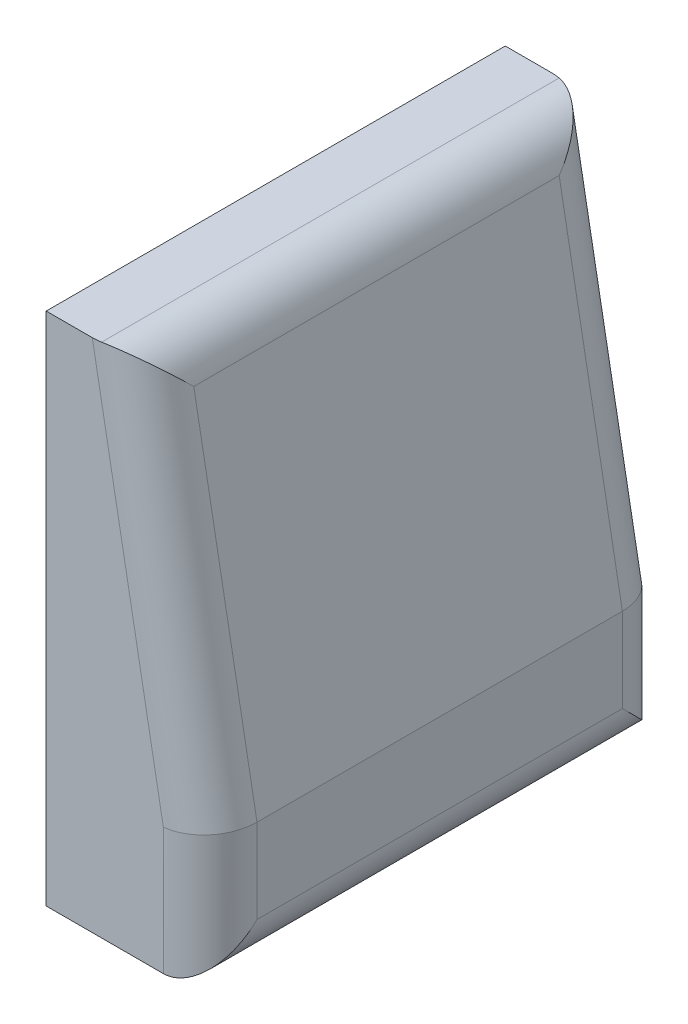
ISO-10303-21;
HEADER;
FILE_DESCRIPTION(('STEP AP214'),'2;1');
FILE_NAME('part.step','',(''),(''),'','','');
FILE_SCHEMA(('AUTOMOTIVE_DESIGN { 1 0 10303 214 1 1 1 1 }'));
ENDSEC;
DATA;
#1=APPLICATION_CONTEXT('core data for automotive mechanical design processes');
#2=APPLICATION_PROTOCOL_DEFINITION('international standard','automotive_design',2000,#1);
#3=PRODUCT_CONTEXT('',#1,'mechanical');
#4=PRODUCT('Part','Part','',(#3));
#5=PRODUCT_RELATED_PRODUCT_CATEGORY('part','',(#4));
#6=PRODUCT_DEFINITION_FORMATION('','',#4);
#7=PRODUCT_DEFINITION_CONTEXT('part definition',#1,'design');
#8=PRODUCT_DEFINITION('design','',#6,#7);
#9=PRODUCT_DEFINITION_SHAPE('','',#8);
#10=(LENGTH_UNIT() NAMED_UNIT(*) SI_UNIT(.MILLI.,.METRE.));
#11=(NAMED_UNIT(*) PLANE_ANGLE_UNIT() SI_UNIT($,.RADIAN.));
#12=(NAMED_UNIT(*) SI_UNIT($,.STERADIAN.) SOLID_ANGLE_UNIT());
#13=UNCERTAINTY_MEASURE_WITH_UNIT(LENGTH_MEASURE(1.E-05),#10,'distance_accuracy_value','');
#14=(GEOMETRIC_REPRESENTATION_CONTEXT(3) GLOBAL_UNCERTAINTY_ASSIGNED_CONTEXT((#13)) GLOBAL_UNIT_ASSIGNED_CONTEXT((#10,
#11,#12)) REPRESENTATION_CONTEXT('',''));
#15=CARTESIAN_POINT('',(0.,0.,0.));
#16=DIRECTION('',(0.,0.,1.));
#17=DIRECTION('',(1.,0.,0.));
#18=AXIS2_PLACEMENT_3D('',#15,#16,#17);
#19=CARTESIAN_POINT('',(200.,550.,490.));
#20=DIRECTION('',(0.,-1.,0.));
#21=DIRECTION('',(0.,0.,-1.));
#22=AXIS2_PLACEMENT_3D('',#19,#20,#21);
#23=PLANE('',#22);
#24=DIRECTION('',(0.,0.,-1.));
#25=VECTOR('',#24,1.);
#26=CARTESIAN_POINT('',(116.633338798208,550.,490.));
#27=LINE('',#26,#25);
#28=CARTESIAN_POINT('',(116.633338798208,550.,488.367740670723));
#29=VERTEX_POINT('',#28);
#30=CARTESIAN_POINT('',(116.633338798208,550.,-488.367740670723));
#31=VERTEX_POINT('',#30);
#32=EDGE_CURVE('E49',#29,#31,#27,.T.);
#33=ORIENTED_EDGE('',*,*,#32,.T.);
#34=CARTESIAN_POINT('',(98.3406558713785,550.,-390.));
#35=DIRECTION('',(0.,-1.,0.));
#36=DIRECTION('',(-1.,0.,0.));
#37=AXIS2_PLACEMENT_3D('',#34,#35,#36);
#38=ELLIPSE('',#37,101.659344128622,100.);
#39=CARTESIAN_POINT('',(98.3406558713786,550.,-490.));
#40=VERTEX_POINT('',#39);
#41=EDGE_CURVE('E11',#31,#40,#38,.F.);
#42=ORIENTED_EDGE('',*,*,#41,.T.);
#43=DIRECTION('',(-1.,0.,0.));
#44=VECTOR('',#43,1.);
#45=CARTESIAN_POINT('',(200.,550.,-490.));
#46=LINE('',#45,#44);
#47=CARTESIAN_POINT('',(1.38210138760916E-13,550.,-490.));
#48=VERTEX_POINT('',#47);
#49=EDGE_CURVE('E122',#40,#48,#46,.T.);
#50=ORIENTED_EDGE('',*,*,#49,.T.);
#51=DIRECTION('',(0.,0.,-1.));
#52=VECTOR('',#51,1.);
#53=CARTESIAN_POINT('',(1.38210138760916E-13,550.,490.));
#54=LINE('',#53,#52);
#55=CARTESIAN_POINT('',(1.38210138760916E-13,550.,490.));
#56=VERTEX_POINT('',#55);
#57=EDGE_CURVE('E115',#56,#48,#54,.T.);
#58=ORIENTED_EDGE('',*,*,#57,.F.);
#59=DIRECTION('',(-1.,0.,0.));
#60=VECTOR('',#59,1.);
#61=CARTESIAN_POINT('',(200.,550.,490.));
#62=LINE('',#61,#60);
#63=CARTESIAN_POINT('',(98.3406558713785,550.,490.));
#64=VERTEX_POINT('',#63);
#65=EDGE_CURVE('E101',#64,#56,#62,.T.);
#66=ORIENTED_EDGE('',*,*,#65,.F.);
#67=CARTESIAN_POINT('',(98.3406558713785,550.,390.));
#68=DIRECTION('',(0.,-1.,0.));
#69=DIRECTION('',(1.,0.,0.));
#70=AXIS2_PLACEMENT_3D('',#67,#68,#69);
#71=ELLIPSE('',#70,101.659344128622,100.);
#72=EDGE_CURVE('E42',#64,#29,#71,.F.);
#73=ORIENTED_EDGE('',*,*,#72,.T.);
#74=EDGE_LOOP('',(#33,#42,#50,#58,#66,#73));
#75=FACE_BOUND('',#74,.T.);
#76=ADVANCED_FACE('F33',(#75),#23,.F.);
#77=CARTESIAN_POINT('',(1.38210138760916E-13,550.,490.));
#78=DIRECTION('',(1.,0.,0.));
#79=DIRECTION('',(0.,0.,-1.));
#80=AXIS2_PLACEMENT_3D('',#77,#78,#79);
#81=PLANE('',#80);
#82=DIRECTION('',(0.,-1.,0.));
#83=VECTOR('',#82,1.);
#84=CARTESIAN_POINT('',(1.38210138760916E-13,550.,-490.));
#85=LINE('',#84,#83);
#86=CARTESIAN_POINT('',(1.38210138760916E-13,-550.,-490.));
#87=VERTEX_POINT('',#86);
#88=EDGE_CURVE('E172',#48,#87,#85,.T.);
#89=ORIENTED_EDGE('',*,*,#88,.T.);
#90=DIRECTION('',(0.,0.,-1.));
#91=VECTOR('',#90,1.);
#92=CARTESIAN_POINT('',(1.38210138760916E-13,-550.,490.));
#93=LINE('',#92,#91);
#94=CARTESIAN_POINT('',(1.38210138760916E-13,-550.,490.));
#95=VERTEX_POINT('',#94);
#96=EDGE_CURVE('E117',#95,#87,#93,.T.);
#97=ORIENTED_EDGE('',*,*,#96,.F.);
#98=DIRECTION('',(0.,-1.,0.));
#99=VECTOR('',#98,1.);
#100=CARTESIAN_POINT('',(1.38210138760916E-13,550.,490.));
#101=LINE('',#100,#99);
#102=EDGE_CURVE('E105',#56,#95,#101,.T.);
#103=ORIENTED_EDGE('',*,*,#102,.F.);
#104=ORIENTED_EDGE('',*,*,#57,.T.);
#105=EDGE_LOOP('',(#89,#97,#103,#104));
#106=FACE_BOUND('',#105,.T.);
#107=ADVANCED_FACE('F114',(#106),#81,.F.);
#108=CARTESIAN_POINT('',(1.38210138760916E-13,-550.,490.));
#109=DIRECTION('',(0.,1.,0.));
#110=DIRECTION('',(-1.,0.,0.));
#111=AXIS2_PLACEMENT_3D('',#108,#109,#110);
#112=PLANE('',#111);
#113=DIRECTION('',(1.,0.,0.));
#114=VECTOR('',#113,1.);
#115=CARTESIAN_POINT('',(1.38210138760916E-13,-550.,-490.));
#116=LINE('',#115,#114);
#117=CARTESIAN_POINT('',(250.,-550.,-490.));
#118=VERTEX_POINT('',#117);
#119=EDGE_CURVE('E110',#87,#118,#116,.T.);
#120=ORIENTED_EDGE('',*,*,#119,.T.);
#121=DIRECTION('',(0.,0.,-1.));
#122=VECTOR('',#121,1.);
#123=CARTESIAN_POINT('',(250.,-550.,490.));
#124=LINE('',#123,#122);
#125=CARTESIAN_POINT('',(250.,-550.,490.));
#126=VERTEX_POINT('',#125);
#127=EDGE_CURVE('E136',#118,#126,#124,.F.);
#128=ORIENTED_EDGE('',*,*,#127,.T.);
#129=DIRECTION('',(1.,0.,0.));
#130=VECTOR('',#129,1.);
#131=CARTESIAN_POINT('',(1.38210138760916E-13,-550.,490.));
#132=LINE('',#131,#130);
#133=EDGE_CURVE('E119',#95,#126,#132,.T.);
#134=ORIENTED_EDGE('',*,*,#133,.F.);
#135=ORIENTED_EDGE('',*,*,#96,.T.);
#136=EDGE_LOOP('',(#120,#128,#134,#135));
#137=FACE_BOUND('',#136,.T.);
#138=ADVANCED_FACE('F183',(#137),#112,.F.);
#139=CARTESIAN_POINT('',(350.,-550.,490.));
#140=DIRECTION('',(-1.,0.,0.));
#141=DIRECTION('',(0.,0.,1.));
#142=AXIS2_PLACEMENT_3D('',#139,#140,#141);
#143=PLANE('',#142);
#144=DIRECTION('',(0.,0.,-1.));
#145=VECTOR('',#144,1.);
#146=CARTESIAN_POINT('',(350.,-270.,490.));
#147=LINE('',#146,#145);
#148=CARTESIAN_POINT('',(350.,-270.,390.));
#149=VERTEX_POINT('',#148);
#150=CARTESIAN_POINT('',(350.,-270.,-390.));
#151=VERTEX_POINT('',#150);
#152=EDGE_CURVE('E128',#149,#151,#147,.T.);
#153=ORIENTED_EDGE('',*,*,#152,.F.);
#154=DIRECTION('',(0.,1.,0.));
#155=VECTOR('',#154,1.);
#156=CARTESIAN_POINT('',(350.,-550.,390.));
#157=LINE('',#156,#155);
#158=CARTESIAN_POINT('',(350.,-450.,390.));
#159=VERTEX_POINT('',#158);
#160=EDGE_CURVE('E134',#149,#159,#157,.F.);
#161=ORIENTED_EDGE('',*,*,#160,.T.);
#162=DIRECTION('',(0.,0.,-1.));
#163=VECTOR('',#162,1.);
#164=CARTESIAN_POINT('',(350.,-450.,490.));
#165=LINE('',#164,#163);
#166=CARTESIAN_POINT('',(350.,-450.,-390.));
#167=VERTEX_POINT('',#166);
#168=EDGE_CURVE('E126',#159,#167,#165,.T.);
#169=ORIENTED_EDGE('',*,*,#168,.T.);
#170=DIRECTION('',(0.,1.,0.));
#171=VECTOR('',#170,1.);
#172=CARTESIAN_POINT('',(350.,-550.,-390.));
#173=LINE('',#172,#171);
#174=EDGE_CURVE('E124',#167,#151,#173,.T.);
#175=ORIENTED_EDGE('',*,*,#174,.T.);
#176=EDGE_LOOP('',(#153,#161,#169,#175));
#177=FACE_BOUND('',#176,.T.);
#178=ADVANCED_FACE('F197',(#177),#143,.F.);
#179=CARTESIAN_POINT('',(350.,-270.,490.));
#180=DIRECTION('',(-0.983677406707227,-0.17994098903181,0.));
#181=DIRECTION('',(0.17994098903181,-0.983677406707227,0.));
#182=AXIS2_PLACEMENT_3D('',#179,#180,#181);
#183=PLANE('',#182);
#184=ORIENTED_EDGE('',*,*,#152,.T.);
#185=DIRECTION('',(-0.17994098903181,0.983677406707227,0.));
#186=VECTOR('',#185,1.);
#187=CARTESIAN_POINT('',(350.,-270.,-390.));
#188=LINE('',#187,#186);
#189=CARTESIAN_POINT('',(215.00107946893,467.994098903181,-390.));
#190=VERTEX_POINT('',#189);
#191=EDGE_CURVE('E150',#151,#190,#188,.T.);
#192=ORIENTED_EDGE('',*,*,#191,.T.);
#193=DIRECTION('',(0.,0.,-1.));
#194=VECTOR('',#193,1.);
#195=CARTESIAN_POINT('',(215.00107946893,467.994098903181,490.));
#196=LINE('',#195,#194);
#197=CARTESIAN_POINT('',(215.00107946893,467.994098903181,390.));
#198=VERTEX_POINT('',#197);
#199=EDGE_CURVE('E146',#190,#198,#196,.F.);
#200=ORIENTED_EDGE('',*,*,#199,.T.);
#201=DIRECTION('',(-0.17994098903181,0.983677406707227,0.));
#202=VECTOR('',#201,1.);
#203=CARTESIAN_POINT('',(350.,-270.,390.));
#204=LINE('',#203,#202);
#205=EDGE_CURVE('E148',#198,#149,#204,.F.);
#206=ORIENTED_EDGE('',*,*,#205,.T.);
#207=EDGE_LOOP('',(#184,#192,#200,#206));
#208=FACE_BOUND('',#207,.T.);
#209=ADVANCED_FACE('F203',(#208),#183,.F.);
#210=CARTESIAN_POINT('',(0.,0.,490.));
#211=DIRECTION('',(0.,0.,1.));
#212=DIRECTION('',(1.,0.,0.));
#213=AXIS2_PLACEMENT_3D('',#210,#211,#212);
#214=PLANE('',#213);
#215=ORIENTED_EDGE('',*,*,#133,.T.);
#216=DIRECTION('',(0.,1.,0.));
#217=VECTOR('',#216,1.);
#218=CARTESIAN_POINT('',(250.,-270.,490.));
#219=LINE('',#218,#217);
#220=CARTESIAN_POINT('',(250.,-279.071081236465,490.));
#221=VERTEX_POINT('',#220);
#222=EDGE_CURVE('E140',#126,#221,#219,.T.);
#223=ORIENTED_EDGE('',*,*,#222,.T.);
#224=DIRECTION('',(-0.17994098903181,0.983677406707227,0.));
#225=VECTOR('',#224,1.);
#226=CARTESIAN_POINT('',(101.632259329277,532.005901096819,490.));
#227=LINE('',#226,#225);
#228=EDGE_CURVE('E108',#221,#64,#227,.T.);
#229=ORIENTED_EDGE('',*,*,#228,.T.);
#230=ORIENTED_EDGE('',*,*,#65,.T.);
#231=ORIENTED_EDGE('',*,*,#102,.T.);
#232=EDGE_LOOP('',(#215,#223,#229,#230,#231));
#233=FACE_BOUND('',#232,.T.);
#234=ADVANCED_FACE('F104',(#233),#214,.T.);
#235=CARTESIAN_POINT('',(0.,0.,-490.));
#236=DIRECTION('',(0.,0.,1.));
#237=DIRECTION('',(1.,0.,0.));
#238=AXIS2_PLACEMENT_3D('',#235,#236,#237);
#239=PLANE('',#238);
#240=DIRECTION('',(-0.17994098903181,0.983677406707227,0.));
#241=VECTOR('',#240,1.);
#242=CARTESIAN_POINT('',(192.508644420657,35.2149959306081,-490.));
#243=LINE('',#242,#241);
#244=CARTESIAN_POINT('',(250.,-279.071081236465,-490.));
#245=VERTEX_POINT('',#244);
#246=EDGE_CURVE('E142',#40,#245,#243,.F.);
#247=ORIENTED_EDGE('',*,*,#246,.T.);
#248=DIRECTION('',(0.,1.,0.));
#249=VECTOR('',#248,1.);
#250=CARTESIAN_POINT('',(250.,0.,-490.));
#251=LINE('',#250,#249);
#252=EDGE_CURVE('E144',#245,#118,#251,.F.);
#253=ORIENTED_EDGE('',*,*,#252,.T.);
#254=ORIENTED_EDGE('',*,*,#119,.F.);
#255=ORIENTED_EDGE('',*,*,#88,.F.);
#256=ORIENTED_EDGE('',*,*,#49,.F.);
#257=EDGE_LOOP('',(#247,#253,#254,#255,#256));
#258=FACE_BOUND('',#257,.T.);
#259=ADVANCED_FACE('F209',(#258),#239,.F.);
#260=CARTESIAN_POINT('',(116.633338798208,450.,490.));
#261=DIRECTION('',(0.,0.,-1.));
#262=DIRECTION('',(-1.,0.,0.));
#263=AXIS2_PLACEMENT_3D('',#260,#261,#262);
#264=CYLINDRICAL_SURFACE('',#263,100.);
#265=CARTESIAN_POINT('',(116.633338798208,450.,-390.));
#266=DIRECTION('',(0.127237493557807,-0.695564964782677,-0.707106781186547));
#267=DIRECTION('',(-0.127237493557807,0.695564964782677,-0.707106781186547));
#268=AXIS2_PLACEMENT_3D('',#265,#266,#267);
#269=ELLIPSE('',#268,141.42135623731,100.);
#270=EDGE_CURVE('E163',#31,#190,#269,.T.);
#271=ORIENTED_EDGE('',*,*,#270,.F.);
#272=ORIENTED_EDGE('',*,*,#32,.F.);
#273=CARTESIAN_POINT('',(116.633338798208,450.,390.));
#274=DIRECTION('',(-0.127237493557807,0.695564964782677,-0.707106781186547));
#275=DIRECTION('',(0.127237493557807,-0.695564964782677,-0.707106781186547));
#276=AXIS2_PLACEMENT_3D('',#273,#274,#275);
#277=ELLIPSE('',#276,141.42135623731,100.);
#278=EDGE_CURVE('E37',#198,#29,#277,.F.);
#279=ORIENTED_EDGE('',*,*,#278,.F.);
#280=ORIENTED_EDGE('',*,*,#199,.F.);
#281=EDGE_LOOP('',(#271,#272,#279,#280));
#282=FACE_BOUND('',#281,.T.);
#283=ADVANCED_FACE('F35',(#282),#264,.T.);
#284=CARTESIAN_POINT('',(192.508644420657,35.2149959306081,390.));
#285=DIRECTION('',(0.17994098903181,-0.983677406707227,0.));
#286=DIRECTION('',(0.983677406707227,0.17994098903181,0.));
#287=AXIS2_PLACEMENT_3D('',#284,#285,#286);
#288=CYLINDRICAL_SURFACE('',#287,100.);
#289=ORIENTED_EDGE('',*,*,#72,.F.);
#290=ORIENTED_EDGE('',*,*,#228,.F.);
#291=CARTESIAN_POINT('',(250.,-279.071081236465,390.));
#292=DIRECTION('',(0.0903398950983827,-0.995910991682295,0.));
#293=DIRECTION('',(0.995910991682295,0.0903398950983818,0.));
#294=AXIS2_PLACEMENT_3D('',#291,#292,#293);
#295=ELLIPSE('',#294,100.410579695561,100.);
#296=EDGE_CURVE('E161',#149,#221,#295,.T.);
#297=ORIENTED_EDGE('',*,*,#296,.F.);
#298=ORIENTED_EDGE('',*,*,#205,.F.);
#299=ORIENTED_EDGE('',*,*,#278,.T.);
#300=EDGE_LOOP('',(#289,#290,#297,#298,#299));
#301=FACE_BOUND('',#300,.T.);
#302=ADVANCED_FACE('F202',(#301),#288,.T.);
#303=CARTESIAN_POINT('',(251.632259329277,-287.994098903181,-390.));
#304=DIRECTION('',(-0.17994098903181,0.983677406707227,0.));
#305=DIRECTION('',(-0.983677406707227,-0.17994098903181,0.));
#306=AXIS2_PLACEMENT_3D('',#303,#304,#305);
#307=CYLINDRICAL_SURFACE('',#306,100.);
#308=ORIENTED_EDGE('',*,*,#270,.T.);
#309=ORIENTED_EDGE('',*,*,#191,.F.);
#310=CARTESIAN_POINT('',(250.,-279.071081236464,-390.));
#311=DIRECTION('',(-0.0903398950983827,0.995910991682295,0.));
#312=DIRECTION('',(-0.995910991682295,-0.0903398950983818,0.));
#313=AXIS2_PLACEMENT_3D('',#310,#311,#312);
#314=ELLIPSE('',#313,100.410579695561,100.);
#315=EDGE_CURVE('E158',#245,#151,#314,.F.);
#316=ORIENTED_EDGE('',*,*,#315,.F.);
#317=ORIENTED_EDGE('',*,*,#246,.F.);
#318=ORIENTED_EDGE('',*,*,#41,.F.);
#319=EDGE_LOOP('',(#308,#309,#316,#317,#318));
#320=FACE_BOUND('',#319,.T.);
#321=ADVANCED_FACE('F207',(#320),#307,.T.);
#322=CARTESIAN_POINT('',(250.,0.,390.));
#323=DIRECTION('',(0.,-1.,0.));
#324=DIRECTION('',(0.,0.,-1.));
#325=AXIS2_PLACEMENT_3D('',#322,#323,#324);
#326=CYLINDRICAL_SURFACE('',#325,100.);
#327=ORIENTED_EDGE('',*,*,#296,.T.);
#328=ORIENTED_EDGE('',*,*,#222,.F.);
#329=CARTESIAN_POINT('',(250.,-450.,390.));
#330=DIRECTION('',(0.,-0.707106781186547,-0.707106781186547));
#331=DIRECTION('',(0.,-0.707106781186547,0.707106781186547));
#332=AXIS2_PLACEMENT_3D('',#329,#330,#331);
#333=ELLIPSE('',#332,141.42135623731,100.);
#334=EDGE_CURVE('E156',#159,#126,#333,.T.);
#335=ORIENTED_EDGE('',*,*,#334,.F.);
#336=ORIENTED_EDGE('',*,*,#160,.F.);
#337=EDGE_LOOP('',(#327,#328,#335,#336));
#338=FACE_BOUND('',#337,.T.);
#339=ADVANCED_FACE('F201',(#338),#326,.T.);
#340=CARTESIAN_POINT('',(250.,-550.,-390.));
#341=DIRECTION('',(0.,1.,0.));
#342=DIRECTION('',(0.,0.,1.));
#343=AXIS2_PLACEMENT_3D('',#340,#341,#342);
#344=CYLINDRICAL_SURFACE('',#343,100.);
#345=ORIENTED_EDGE('',*,*,#315,.T.);
#346=ORIENTED_EDGE('',*,*,#174,.F.);
#347=CARTESIAN_POINT('',(250.,-450.,-390.));
#348=DIRECTION('',(0.,0.707106781186547,-0.707106781186547));
#349=DIRECTION('',(0.,0.707106781186547,0.707106781186547));
#350=AXIS2_PLACEMENT_3D('',#347,#348,#349);
#351=ELLIPSE('',#350,141.42135623731,100.);
#352=EDGE_CURVE('E154',#118,#167,#351,.F.);
#353=ORIENTED_EDGE('',*,*,#352,.F.);
#354=ORIENTED_EDGE('',*,*,#252,.F.);
#355=EDGE_LOOP('',(#345,#346,#353,#354));
#356=FACE_BOUND('',#355,.T.);
#357=ADVANCED_FACE('F194',(#356),#344,.T.);
#358=CARTESIAN_POINT('',(250.,-450.,490.));
#359=DIRECTION('',(0.,0.,-1.));
#360=DIRECTION('',(-1.,0.,0.));
#361=AXIS2_PLACEMENT_3D('',#358,#359,#360);
#362=CYLINDRICAL_SURFACE('',#361,100.);
#363=ORIENTED_EDGE('',*,*,#334,.T.);
#364=ORIENTED_EDGE('',*,*,#127,.F.);
#365=ORIENTED_EDGE('',*,*,#352,.T.);
#366=ORIENTED_EDGE('',*,*,#168,.F.);
#367=EDGE_LOOP('',(#363,#364,#365,#366));
#368=FACE_BOUND('',#367,.T.);
#369=ADVANCED_FACE('F188',(#368),#362,.T.);
#370=CLOSED_SHELL('',(#76,#107,#138,#178,#209,#234,#259,#283,#302,#321,#339,#357,#369));
#371=MANIFOLD_SOLID_BREP('B2',#370);
#372=ADVANCED_BREP_SHAPE_REPRESENTATION('',(#18,#371),#14);
#373=SHAPE_DEFINITION_REPRESENTATION(#9,#372);
ENDSEC;
END-ISO-10303-21;
